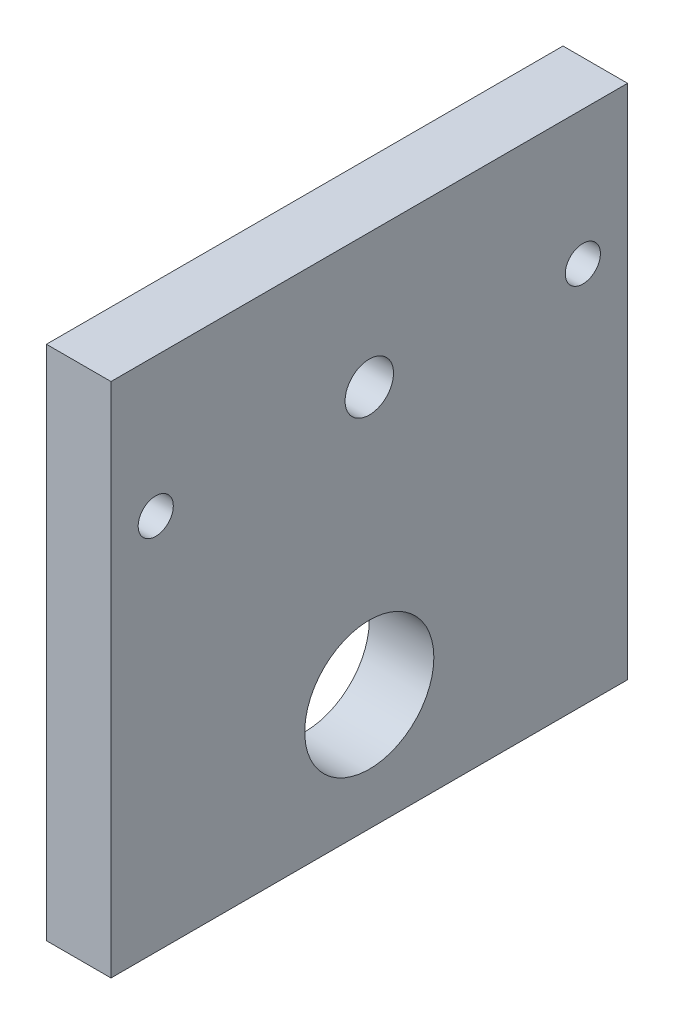
ISO-10303-21;
HEADER;
FILE_DESCRIPTION(('STEP AP214'),'2;1');
FILE_NAME('part.step','',(''),(''),'','','');
FILE_SCHEMA(('AUTOMOTIVE_DESIGN { 1 0 10303 214 1 1 1 1 }'));
ENDSEC;
DATA;
#1=APPLICATION_CONTEXT('core data for automotive mechanical design processes');
#2=APPLICATION_PROTOCOL_DEFINITION('international standard','automotive_design',2000,#1);
#3=PRODUCT_CONTEXT('',#1,'mechanical');
#4=PRODUCT('Part','Part','',(#3));
#5=PRODUCT_RELATED_PRODUCT_CATEGORY('part','',(#4));
#6=PRODUCT_DEFINITION_FORMATION('','',#4);
#7=PRODUCT_DEFINITION_CONTEXT('part definition',#1,'design');
#8=PRODUCT_DEFINITION('design','',#6,#7);
#9=PRODUCT_DEFINITION_SHAPE('','',#8);
#10=(LENGTH_UNIT() NAMED_UNIT(*) SI_UNIT(.MILLI.,.METRE.));
#11=(NAMED_UNIT(*) PLANE_ANGLE_UNIT() SI_UNIT($,.RADIAN.));
#12=(NAMED_UNIT(*) SI_UNIT($,.STERADIAN.) SOLID_ANGLE_UNIT());
#13=UNCERTAINTY_MEASURE_WITH_UNIT(LENGTH_MEASURE(1.E-05),#10,'distance_accuracy_value','');
#14=(GEOMETRIC_REPRESENTATION_CONTEXT(3) GLOBAL_UNCERTAINTY_ASSIGNED_CONTEXT((#13)) GLOBAL_UNIT_ASSIGNED_CONTEXT((#10,
#11,#12)) REPRESENTATION_CONTEXT('',''));
#15=CARTESIAN_POINT('',(0.,0.,0.));
#16=DIRECTION('',(0.,0.,1.));
#17=DIRECTION('',(1.,0.,0.));
#18=AXIS2_PLACEMENT_3D('',#15,#16,#17);
#19=CARTESIAN_POINT('',(6.35,-25.4,-25.4));
#20=DIRECTION('',(0.,0.,1.));
#21=DIRECTION('',(1.,0.,0.));
#22=AXIS2_PLACEMENT_3D('',#19,#20,#21);
#23=PLANE('',#22);
#24=CARTESIAN_POINT('',(3.175,-19.05,-25.4));
#25=DIRECTION('',(0.,0.,-1.));
#26=DIRECTION('',(-1.,0.,0.));
#27=AXIS2_PLACEMENT_3D('',#24,#25,#26);
#28=CIRCLE('',#27,2.0193);
#29=CARTESIAN_POINT('',(1.1557,-19.05,-25.4));
#30=VERTEX_POINT('',#29);
#31=EDGE_CURVE('E102',#30,#30,#28,.T.);
#32=ORIENTED_EDGE('',*,*,#31,.F.);
#33=EDGE_LOOP('',(#32));
#34=FACE_BOUND('',#33,.T.);
#35=CARTESIAN_POINT('',(3.175,19.05,-25.4));
#36=DIRECTION('',(0.,0.,-1.));
#37=DIRECTION('',(-1.,0.,0.));
#38=AXIS2_PLACEMENT_3D('',#35,#36,#37);
#39=CIRCLE('',#38,2.0193);
#40=CARTESIAN_POINT('',(1.1557,19.05,-25.4));
#41=VERTEX_POINT('',#40);
#42=EDGE_CURVE('E101',#41,#41,#39,.T.);
#43=ORIENTED_EDGE('',*,*,#42,.F.);
#44=EDGE_LOOP('',(#43));
#45=FACE_BOUND('',#44,.T.);
#46=DIRECTION('',(0.,1.,0.));
#47=VECTOR('',#46,1.);
#48=CARTESIAN_POINT('',(0.,-25.4,-25.4));
#49=LINE('',#48,#47);
#50=CARTESIAN_POINT('',(0.,-25.4,-25.4));
#51=VERTEX_POINT('',#50);
#52=CARTESIAN_POINT('',(0.,25.4,-25.4));
#53=VERTEX_POINT('',#52);
#54=EDGE_CURVE('E136',#51,#53,#49,.T.);
#55=ORIENTED_EDGE('',*,*,#54,.T.);
#56=DIRECTION('',(-1.,0.,0.));
#57=VECTOR('',#56,1.);
#58=CARTESIAN_POINT('',(6.35,25.4,-25.4));
#59=LINE('',#58,#57);
#60=CARTESIAN_POINT('',(6.35,25.4,-25.4));
#61=VERTEX_POINT('',#60);
#62=EDGE_CURVE('E11',#61,#53,#59,.T.);
#63=ORIENTED_EDGE('',*,*,#62,.F.);
#64=DIRECTION('',(0.,1.,0.));
#65=VECTOR('',#64,1.);
#66=CARTESIAN_POINT('',(6.35,-25.4,-25.4));
#67=LINE('',#66,#65);
#68=CARTESIAN_POINT('',(6.35,-25.4,-25.4));
#69=VERTEX_POINT('',#68);
#70=EDGE_CURVE('E137',#69,#61,#67,.T.);
#71=ORIENTED_EDGE('',*,*,#70,.F.);
#72=DIRECTION('',(-1.,0.,0.));
#73=VECTOR('',#72,1.);
#74=CARTESIAN_POINT('',(6.35,-25.4,-25.4));
#75=LINE('',#74,#73);
#76=EDGE_CURVE('E143',#69,#51,#75,.T.);
#77=ORIENTED_EDGE('',*,*,#76,.T.);
#78=EDGE_LOOP('',(#55,#63,#71,#77));
#79=FACE_BOUND('',#78,.T.);
#80=ADVANCED_FACE('F37',(#34,#45,#79),#23,.F.);
#81=CARTESIAN_POINT('',(6.35,25.4,25.4));
#82=DIRECTION('',(0.,-1.,0.));
#83=DIRECTION('',(0.,0.,-1.));
#84=AXIS2_PLACEMENT_3D('',#81,#82,#83);
#85=PLANE('',#84);
#86=DIRECTION('',(0.,0.,1.));
#87=VECTOR('',#86,1.);
#88=CARTESIAN_POINT('',(0.,25.4,25.4));
#89=LINE('',#88,#87);
#90=CARTESIAN_POINT('',(0.,25.4,25.4));
#91=VERTEX_POINT('',#90);
#92=EDGE_CURVE('E146',#53,#91,#89,.T.);
#93=ORIENTED_EDGE('',*,*,#92,.T.);
#94=DIRECTION('',(-1.,0.,0.));
#95=VECTOR('',#94,1.);
#96=CARTESIAN_POINT('',(6.35,25.4,25.4));
#97=LINE('',#96,#95);
#98=CARTESIAN_POINT('',(6.35,25.4,25.4));
#99=VERTEX_POINT('',#98);
#100=EDGE_CURVE('E45',#99,#91,#97,.T.);
#101=ORIENTED_EDGE('',*,*,#100,.F.);
#102=DIRECTION('',(0.,0.,1.));
#103=VECTOR('',#102,1.);
#104=CARTESIAN_POINT('',(6.35,25.4,25.4));
#105=LINE('',#104,#103);
#106=EDGE_CURVE('E84',#61,#99,#105,.T.);
#107=ORIENTED_EDGE('',*,*,#106,.F.);
#108=ORIENTED_EDGE('',*,*,#62,.T.);
#109=EDGE_LOOP('',(#93,#101,#107,#108));
#110=FACE_BOUND('',#109,.T.);
#111=ADVANCED_FACE('F170',(#110),#85,.F.);
#112=CARTESIAN_POINT('',(6.35,-25.4,25.4));
#113=DIRECTION('',(0.,0.,-1.));
#114=DIRECTION('',(-1.,0.,0.));
#115=AXIS2_PLACEMENT_3D('',#112,#113,#114);
#116=PLANE('',#115);
#117=DIRECTION('',(0.,-1.,0.));
#118=VECTOR('',#117,1.);
#119=CARTESIAN_POINT('',(0.,-25.4,25.4));
#120=LINE('',#119,#118);
#121=CARTESIAN_POINT('',(0.,-25.4,25.4));
#122=VERTEX_POINT('',#121);
#123=EDGE_CURVE('E71',#91,#122,#120,.T.);
#124=ORIENTED_EDGE('',*,*,#123,.T.);
#125=DIRECTION('',(-1.,0.,0.));
#126=VECTOR('',#125,1.);
#127=CARTESIAN_POINT('',(6.35,-25.4,25.4));
#128=LINE('',#127,#126);
#129=CARTESIAN_POINT('',(6.35,-25.4,25.4));
#130=VERTEX_POINT('',#129);
#131=EDGE_CURVE('E151',#130,#122,#128,.T.);
#132=ORIENTED_EDGE('',*,*,#131,.F.);
#133=DIRECTION('',(0.,-1.,0.));
#134=VECTOR('',#133,1.);
#135=CARTESIAN_POINT('',(6.35,-25.4,25.4));
#136=LINE('',#135,#134);
#137=EDGE_CURVE('E140',#99,#130,#136,.T.);
#138=ORIENTED_EDGE('',*,*,#137,.F.);
#139=ORIENTED_EDGE('',*,*,#100,.T.);
#140=EDGE_LOOP('',(#124,#132,#138,#139));
#141=FACE_BOUND('',#140,.T.);
#142=ADVANCED_FACE('F153',(#141),#116,.F.);
#143=CARTESIAN_POINT('',(6.35,-25.4,25.4));
#144=DIRECTION('',(0.,1.,0.));
#145=DIRECTION('',(0.,0.,1.));
#146=AXIS2_PLACEMENT_3D('',#143,#144,#145);
#147=PLANE('',#146);
#148=DIRECTION('',(0.,0.,-1.));
#149=VECTOR('',#148,1.);
#150=CARTESIAN_POINT('',(0.,-25.4,25.4));
#151=LINE('',#150,#149);
#152=EDGE_CURVE('E77',#122,#51,#151,.T.);
#153=ORIENTED_EDGE('',*,*,#152,.T.);
#154=ORIENTED_EDGE('',*,*,#76,.F.);
#155=DIRECTION('',(0.,0.,-1.));
#156=VECTOR('',#155,1.);
#157=CARTESIAN_POINT('',(6.35,-25.4,25.4));
#158=LINE('',#157,#156);
#159=EDGE_CURVE('E53',#130,#69,#158,.T.);
#160=ORIENTED_EDGE('',*,*,#159,.F.);
#161=ORIENTED_EDGE('',*,*,#131,.T.);
#162=EDGE_LOOP('',(#153,#154,#160,#161));
#163=FACE_BOUND('',#162,.T.);
#164=ADVANCED_FACE('F160',(#163),#147,.F.);
#165=CARTESIAN_POINT('',(6.35,0.,0.));
#166=DIRECTION('',(-1.,0.,0.));
#167=DIRECTION('',(0.,0.,1.));
#168=AXIS2_PLACEMENT_3D('',#165,#166,#167);
#169=PLANE('',#168);
#170=CARTESIAN_POINT('',(6.35,12.2301,-21.));
#171=DIRECTION('',(1.,0.,0.));
#172=DIRECTION('',(0.,0.,-1.));
#173=AXIS2_PLACEMENT_3D('',#170,#171,#172);
#174=CIRCLE('',#173,1.72719999999999);
#175=CARTESIAN_POINT('',(6.35,12.2301,-22.7272));
#176=VERTEX_POINT('',#175);
#177=EDGE_CURVE('E112',#176,#176,#174,.T.);
#178=ORIENTED_EDGE('',*,*,#177,.F.);
#179=EDGE_LOOP('',(#178));
#180=FACE_BOUND('',#179,.T.);
#181=CARTESIAN_POINT('',(6.35,11.7414591500542,21.));
#182=DIRECTION('',(1.,0.,0.));
#183=DIRECTION('',(0.,0.,-1.));
#184=AXIS2_PLACEMENT_3D('',#181,#182,#183);
#185=CIRCLE('',#184,1.72719999999999);
#186=CARTESIAN_POINT('',(6.35,11.7414591500542,19.2728));
#187=VERTEX_POINT('',#186);
#188=EDGE_CURVE('E118',#187,#187,#185,.T.);
#189=ORIENTED_EDGE('',*,*,#188,.F.);
#190=EDGE_LOOP('',(#189));
#191=FACE_BOUND('',#190,.T.);
#192=CARTESIAN_POINT('',(6.35,12.2301,0.));
#193=DIRECTION('',(1.,0.,0.));
#194=DIRECTION('',(0.,0.,-1.));
#195=AXIS2_PLACEMENT_3D('',#192,#193,#194);
#196=CIRCLE('',#195,2.38124999999999);
#197=CARTESIAN_POINT('',(6.35,12.2301,-2.38124999999999));
#198=VERTEX_POINT('',#197);
#199=EDGE_CURVE('E124',#198,#198,#196,.T.);
#200=ORIENTED_EDGE('',*,*,#199,.F.);
#201=EDGE_LOOP('',(#200));
#202=FACE_BOUND('',#201,.T.);
#203=CARTESIAN_POINT('',(6.35,-13.97,0.));
#204=DIRECTION('',(1.,0.,0.));
#205=DIRECTION('',(0.,0.,-1.));
#206=AXIS2_PLACEMENT_3D('',#203,#204,#205);
#207=CIRCLE('',#206,6.34999999999999);
#208=CARTESIAN_POINT('',(6.35,-13.97,-6.34999999999999));
#209=VERTEX_POINT('',#208);
#210=EDGE_CURVE('E130',#209,#209,#207,.T.);
#211=ORIENTED_EDGE('',*,*,#210,.F.);
#212=EDGE_LOOP('',(#211));
#213=FACE_BOUND('',#212,.T.);
#214=ORIENTED_EDGE('',*,*,#70,.T.);
#215=ORIENTED_EDGE('',*,*,#106,.T.);
#216=ORIENTED_EDGE('',*,*,#137,.T.);
#217=ORIENTED_EDGE('',*,*,#159,.T.);
#218=EDGE_LOOP('',(#214,#215,#216,#217));
#219=FACE_BOUND('',#218,.T.);
#220=ADVANCED_FACE('F162',(#180,#191,#202,#213,#219),#169,.F.);
#221=CARTESIAN_POINT('',(0.,0.,0.));
#222=DIRECTION('',(-1.,0.,0.));
#223=DIRECTION('',(0.,0.,1.));
#224=AXIS2_PLACEMENT_3D('',#221,#222,#223);
#225=PLANE('',#224);
#226=CARTESIAN_POINT('',(0.,12.2301,-21.));
#227=DIRECTION('',(-1.,0.,0.));
#228=DIRECTION('',(0.,0.,1.));
#229=AXIS2_PLACEMENT_3D('',#226,#227,#228);
#230=CIRCLE('',#229,1.72719999999999);
#231=CARTESIAN_POINT('',(0.,12.2301,-19.2728));
#232=VERTEX_POINT('',#231);
#233=EDGE_CURVE('E115',#232,#232,#230,.T.);
#234=ORIENTED_EDGE('',*,*,#233,.F.);
#235=EDGE_LOOP('',(#234));
#236=FACE_BOUND('',#235,.T.);
#237=CARTESIAN_POINT('',(0.,11.7414591500542,21.));
#238=DIRECTION('',(-1.,0.,0.));
#239=DIRECTION('',(0.,0.,1.));
#240=AXIS2_PLACEMENT_3D('',#237,#238,#239);
#241=CIRCLE('',#240,1.72719999999999);
#242=CARTESIAN_POINT('',(0.,11.7414591500542,22.7272));
#243=VERTEX_POINT('',#242);
#244=EDGE_CURVE('E121',#243,#243,#241,.T.);
#245=ORIENTED_EDGE('',*,*,#244,.F.);
#246=EDGE_LOOP('',(#245));
#247=FACE_BOUND('',#246,.T.);
#248=CARTESIAN_POINT('',(0.,12.2301,0.));
#249=DIRECTION('',(-1.,0.,0.));
#250=DIRECTION('',(0.,0.,1.));
#251=AXIS2_PLACEMENT_3D('',#248,#249,#250);
#252=CIRCLE('',#251,2.38124999999999);
#253=CARTESIAN_POINT('',(0.,12.2301,2.38124999999999));
#254=VERTEX_POINT('',#253);
#255=EDGE_CURVE('E127',#254,#254,#252,.T.);
#256=ORIENTED_EDGE('',*,*,#255,.F.);
#257=EDGE_LOOP('',(#256));
#258=FACE_BOUND('',#257,.T.);
#259=CARTESIAN_POINT('',(0.,-13.97,0.));
#260=DIRECTION('',(-1.,0.,0.));
#261=DIRECTION('',(0.,0.,1.));
#262=AXIS2_PLACEMENT_3D('',#259,#260,#261);
#263=CIRCLE('',#262,6.34999999999999);
#264=CARTESIAN_POINT('',(0.,-13.97,6.34999999999998));
#265=VERTEX_POINT('',#264);
#266=EDGE_CURVE('E133',#265,#265,#263,.T.);
#267=ORIENTED_EDGE('',*,*,#266,.F.);
#268=EDGE_LOOP('',(#267));
#269=FACE_BOUND('',#268,.T.);
#270=ORIENTED_EDGE('',*,*,#54,.F.);
#271=ORIENTED_EDGE('',*,*,#152,.F.);
#272=ORIENTED_EDGE('',*,*,#123,.F.);
#273=ORIENTED_EDGE('',*,*,#92,.F.);
#274=EDGE_LOOP('',(#270,#271,#272,#273));
#275=FACE_BOUND('',#274,.T.);
#276=ADVANCED_FACE('F156',(#236,#247,#258,#269,#275),#225,.T.);
#277=CARTESIAN_POINT('',(6.35,-13.97,0.));
#278=DIRECTION('',(1.,0.,0.));
#279=DIRECTION('',(0.,0.,-1.));
#280=AXIS2_PLACEMENT_3D('',#277,#278,#279);
#281=CYLINDRICAL_SURFACE('',#280,6.34999999999999);
#282=ORIENTED_EDGE('',*,*,#266,.T.);
#283=EDGE_LOOP('',(#282));
#284=FACE_BOUND('',#283,.T.);
#285=ORIENTED_EDGE('',*,*,#210,.T.);
#286=EDGE_LOOP('',(#285));
#287=FACE_BOUND('',#286,.T.);
#288=ADVANCED_FACE('F205',(#284,#287),#281,.F.);
#289=CARTESIAN_POINT('',(6.35,12.2301,0.));
#290=DIRECTION('',(1.,0.,0.));
#291=DIRECTION('',(0.,0.,-1.));
#292=AXIS2_PLACEMENT_3D('',#289,#290,#291);
#293=CYLINDRICAL_SURFACE('',#292,2.38124999999999);
#294=ORIENTED_EDGE('',*,*,#255,.T.);
#295=EDGE_LOOP('',(#294));
#296=FACE_BOUND('',#295,.T.);
#297=ORIENTED_EDGE('',*,*,#199,.T.);
#298=EDGE_LOOP('',(#297));
#299=FACE_BOUND('',#298,.T.);
#300=ADVANCED_FACE('F201',(#296,#299),#293,.F.);
#301=CARTESIAN_POINT('',(6.35,11.7414591500542,21.));
#302=DIRECTION('',(1.,0.,0.));
#303=DIRECTION('',(0.,0.,-1.));
#304=AXIS2_PLACEMENT_3D('',#301,#302,#303);
#305=CYLINDRICAL_SURFACE('',#304,1.72719999999999);
#306=ORIENTED_EDGE('',*,*,#244,.T.);
#307=EDGE_LOOP('',(#306));
#308=FACE_BOUND('',#307,.T.);
#309=ORIENTED_EDGE('',*,*,#188,.T.);
#310=EDGE_LOOP('',(#309));
#311=FACE_BOUND('',#310,.T.);
#312=ADVANCED_FACE('F197',(#308,#311),#305,.F.);
#313=CARTESIAN_POINT('',(6.35,12.2301,-21.));
#314=DIRECTION('',(1.,0.,0.));
#315=DIRECTION('',(0.,0.,-1.));
#316=AXIS2_PLACEMENT_3D('',#313,#314,#315);
#317=CYLINDRICAL_SURFACE('',#316,1.72719999999999);
#318=ORIENTED_EDGE('',*,*,#233,.T.);
#319=EDGE_LOOP('',(#318));
#320=FACE_BOUND('',#319,.T.);
#321=ORIENTED_EDGE('',*,*,#177,.T.);
#322=EDGE_LOOP('',(#321));
#323=FACE_BOUND('',#322,.T.);
#324=ADVANCED_FACE('F189',(#320,#323),#317,.F.);
#325=CARTESIAN_POINT('',(3.175,19.05,-13.462));
#326=DIRECTION('',(0.,0.,-1.));
#327=DIRECTION('',(-1.,0.,0.));
#328=AXIS2_PLACEMENT_3D('',#325,#326,#327);
#329=CONICAL_SURFACE('',#328,2.0193,1.02974425867665);
#330=CARTESIAN_POINT('',(3.175,19.05,-12.2486821519976));
#331=VERTEX_POINT('',#330);
#332=VERTEX_LOOP('',#331);
#333=FACE_BOUND('',#332,.T.);
#334=CARTESIAN_POINT('',(3.175,19.05,-13.462));
#335=DIRECTION('',(0.,0.,-1.));
#336=DIRECTION('',(-1.,0.,0.));
#337=AXIS2_PLACEMENT_3D('',#334,#335,#336);
#338=CIRCLE('',#337,2.0193);
#339=CARTESIAN_POINT('',(1.1557,19.05,-13.462));
#340=VERTEX_POINT('',#339);
#341=EDGE_CURVE('E105',#340,#340,#338,.T.);
#342=ORIENTED_EDGE('',*,*,#341,.T.);
#343=EDGE_LOOP('',(#342));
#344=FACE_BOUND('',#343,.T.);
#345=ADVANCED_FACE('F183',(#333,#344),#329,.F.);
#346=CARTESIAN_POINT('',(3.175,19.05,-25.4));
#347=DIRECTION('',(0.,0.,-1.));
#348=DIRECTION('',(-1.,0.,0.));
#349=AXIS2_PLACEMENT_3D('',#346,#347,#348);
#350=CYLINDRICAL_SURFACE('',#349,2.0193);
#351=ORIENTED_EDGE('',*,*,#341,.F.);
#352=EDGE_LOOP('',(#351));
#353=FACE_BOUND('',#352,.T.);
#354=ORIENTED_EDGE('',*,*,#42,.T.);
#355=EDGE_LOOP('',(#354));
#356=FACE_BOUND('',#355,.T.);
#357=ADVANCED_FACE('F95',(#353,#356),#350,.F.);
#358=CARTESIAN_POINT('',(3.175,-19.05,-13.462));
#359=DIRECTION('',(0.,0.,-1.));
#360=DIRECTION('',(-1.,0.,0.));
#361=AXIS2_PLACEMENT_3D('',#358,#359,#360);
#362=CONICAL_SURFACE('',#361,2.0193,1.02974425867665);
#363=CARTESIAN_POINT('',(3.175,-19.05,-12.2486821519976));
#364=VERTEX_POINT('',#363);
#365=VERTEX_LOOP('',#364);
#366=FACE_BOUND('',#365,.T.);
#367=CARTESIAN_POINT('',(3.175,-19.05,-13.462));
#368=DIRECTION('',(0.,0.,-1.));
#369=DIRECTION('',(-1.,0.,0.));
#370=AXIS2_PLACEMENT_3D('',#367,#368,#369);
#371=CIRCLE('',#370,2.0193);
#372=CARTESIAN_POINT('',(1.1557,-19.05,-13.462));
#373=VERTEX_POINT('',#372);
#374=EDGE_CURVE('E99',#373,#373,#371,.T.);
#375=ORIENTED_EDGE('',*,*,#374,.T.);
#376=EDGE_LOOP('',(#375));
#377=FACE_BOUND('',#376,.T.);
#378=ADVANCED_FACE('F91',(#366,#377),#362,.F.);
#379=CARTESIAN_POINT('',(3.175,-19.05,-25.4));
#380=DIRECTION('',(0.,0.,-1.));
#381=DIRECTION('',(-1.,0.,0.));
#382=AXIS2_PLACEMENT_3D('',#379,#380,#381);
#383=CYLINDRICAL_SURFACE('',#382,2.0193);
#384=ORIENTED_EDGE('',*,*,#374,.F.);
#385=EDGE_LOOP('',(#384));
#386=FACE_BOUND('',#385,.T.);
#387=ORIENTED_EDGE('',*,*,#31,.T.);
#388=EDGE_LOOP('',(#387));
#389=FACE_BOUND('',#388,.T.);
#390=ADVANCED_FACE('F94',(#386,#389),#383,.F.);
#391=CLOSED_SHELL('',(#80,#111,#142,#164,#220,#276,#288,#300,#312,#324,#345,#357,#378,#390));
#392=MANIFOLD_SOLID_BREP('B2',#391);
#393=ADVANCED_BREP_SHAPE_REPRESENTATION('',(#18,#392),#14);
#394=SHAPE_DEFINITION_REPRESENTATION(#9,#393);
ENDSEC;
END-ISO-10303-21;
